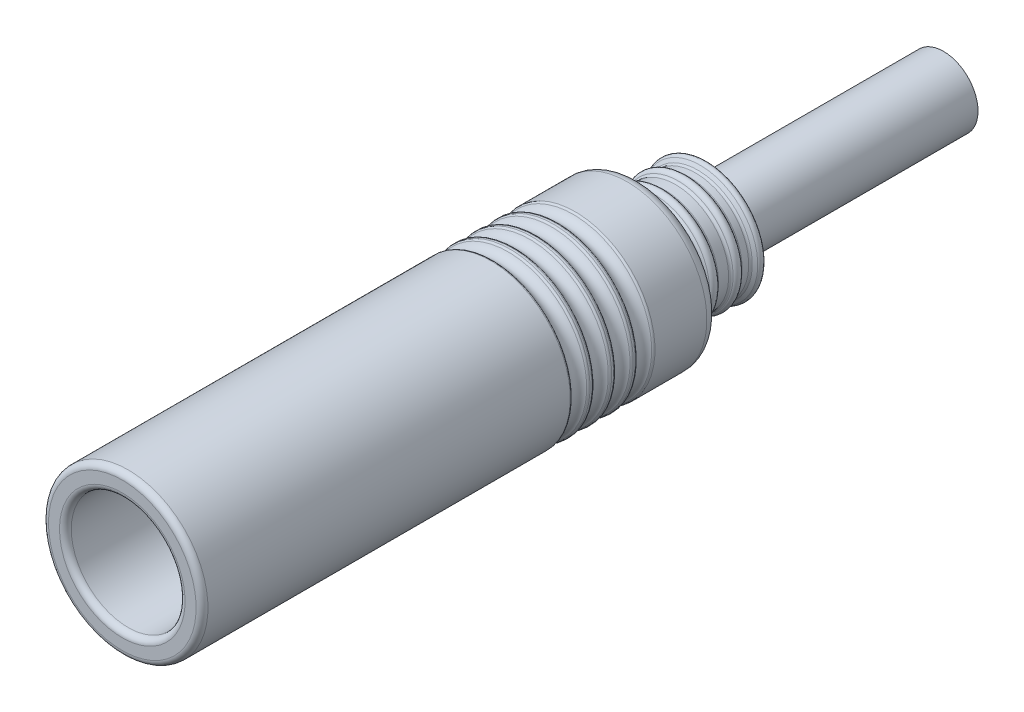
ISO-10303-21;
HEADER;
FILE_DESCRIPTION(('STEP AP214'),'2;1');
FILE_NAME('part.step','',(''),(''),'','','');
FILE_SCHEMA(('AUTOMOTIVE_DESIGN { 1 0 10303 214 1 1 1 1 }'));
ENDSEC;
DATA;
#1=APPLICATION_CONTEXT('core data for automotive mechanical design processes');
#2=APPLICATION_PROTOCOL_DEFINITION('international standard','automotive_design',2000,#1);
#3=PRODUCT_CONTEXT('',#1,'mechanical');
#4=PRODUCT('Part','Part','',(#3));
#5=PRODUCT_RELATED_PRODUCT_CATEGORY('part','',(#4));
#6=PRODUCT_DEFINITION_FORMATION('','',#4);
#7=PRODUCT_DEFINITION_CONTEXT('part definition',#1,'design');
#8=PRODUCT_DEFINITION('design','',#6,#7);
#9=PRODUCT_DEFINITION_SHAPE('','',#8);
#10=(LENGTH_UNIT() NAMED_UNIT(*) SI_UNIT(.MILLI.,.METRE.));
#11=(NAMED_UNIT(*) PLANE_ANGLE_UNIT() SI_UNIT($,.RADIAN.));
#12=(NAMED_UNIT(*) SI_UNIT($,.STERADIAN.) SOLID_ANGLE_UNIT());
#13=UNCERTAINTY_MEASURE_WITH_UNIT(LENGTH_MEASURE(1.E-05),#10,'distance_accuracy_value','');
#14=(GEOMETRIC_REPRESENTATION_CONTEXT(3) GLOBAL_UNCERTAINTY_ASSIGNED_CONTEXT((#13)) GLOBAL_UNIT_ASSIGNED_CONTEXT((#10,
#11,#12)) REPRESENTATION_CONTEXT('',''));
#15=CARTESIAN_POINT('',(0.,0.,0.));
#16=DIRECTION('',(0.,0.,1.));
#17=DIRECTION('',(1.,0.,0.));
#18=AXIS2_PLACEMENT_3D('',#15,#16,#17);
#19=CARTESIAN_POINT('',(0.,0.,-49.5));
#20=DIRECTION('',(0.,0.,-1.));
#21=DIRECTION('',(-1.,0.,0.));
#22=AXIS2_PLACEMENT_3D('',#19,#20,#21);
#23=CYLINDRICAL_SURFACE('',#22,6.75);
#24=CARTESIAN_POINT('',(0.,0.,-32.9980371945521));
#25=DIRECTION('',(0.,0.,-1.));
#26=DIRECTION('',(-1.,0.,0.));
#27=AXIS2_PLACEMENT_3D('',#24,#25,#26);
#28=CIRCLE('',#27,6.75);
#29=CARTESIAN_POINT('',(-6.75,0.,-32.9980371945521));
#30=VERTEX_POINT('',#29);
#31=EDGE_CURVE('E167',#30,#30,#28,.T.);
#32=ORIENTED_EDGE('',*,*,#31,.F.);
#33=EDGE_LOOP('',(#32));
#34=FACE_BOUND('',#33,.T.);
#35=CARTESIAN_POINT('',(0.,0.,-32.8352961387813));
#36=DIRECTION('',(0.,0.,-1.));
#37=DIRECTION('',(-1.,0.,0.));
#38=AXIS2_PLACEMENT_3D('',#35,#36,#37);
#39=CIRCLE('',#38,6.75);
#40=CARTESIAN_POINT('',(-6.75,0.,-32.8352961387813));
#41=VERTEX_POINT('',#40);
#42=EDGE_CURVE('E49',#41,#41,#39,.T.);
#43=ORIENTED_EDGE('',*,*,#42,.T.);
#44=EDGE_LOOP('',(#43));
#45=FACE_BOUND('',#44,.T.);
#46=ADVANCED_FACE('F42',(#34,#45),#23,.T.);
#47=CARTESIAN_POINT('',(0.,0.,-32.8352961387813));
#48=DIRECTION('',(0.,0.,-1.));
#49=DIRECTION('',(-1.,0.,0.));
#50=AXIS2_PLACEMENT_3D('',#47,#48,#49);
#51=TOROIDAL_SURFACE('',#50,6.54999999999996,0.200000000000001);
#52=CARTESIAN_POINT('',(0.,0.,-32.6594443200905));
#53=DIRECTION('',(0.,0.,-1.));
#54=DIRECTION('',(-1.,0.,0.));
#55=AXIS2_PLACEMENT_3D('',#52,#53,#54);
#56=CIRCLE('',#55,6.6452687664617);
#57=CARTESIAN_POINT('',(-6.6452687664617,0.,-32.6594443200905));
#58=VERTEX_POINT('',#57);
#59=EDGE_CURVE('E53',#58,#58,#56,.T.);
#60=ORIENTED_EDGE('',*,*,#59,.T.);
#61=EDGE_LOOP('',(#60));
#62=FACE_BOUND('',#61,.T.);
#63=ORIENTED_EDGE('',*,*,#42,.F.);
#64=EDGE_LOOP('',(#63));
#65=FACE_BOUND('',#64,.T.);
#66=ADVANCED_FACE('F44',(#62,#65),#51,.T.);
#67=CARTESIAN_POINT('',(0.,0.,-32.));
#68=DIRECTION('',(0.,0.,-1.));
#69=DIRECTION('',(-1.,0.,0.));
#70=AXIS2_PLACEMENT_3D('',#67,#68,#69);
#71=TOROIDAL_SURFACE('',#70,7.00252664069321,0.749999999999997);
#72=ORIENTED_EDGE('',*,*,#59,.F.);
#73=EDGE_LOOP('',(#72));
#74=FACE_BOUND('',#73,.T.);
#75=CARTESIAN_POINT('',(0.,0.,-31.3405556799095));
#76=DIRECTION('',(0.,0.,-1.));
#77=DIRECTION('',(-1.,0.,0.));
#78=AXIS2_PLACEMENT_3D('',#75,#76,#77);
#79=CIRCLE('',#78,6.6452687664617);
#80=CARTESIAN_POINT('',(-6.6452687664617,0.,-31.3405556799095));
#81=VERTEX_POINT('',#80);
#82=EDGE_CURVE('E57',#81,#81,#79,.T.);
#83=ORIENTED_EDGE('',*,*,#82,.T.);
#84=EDGE_LOOP('',(#83));
#85=FACE_BOUND('',#84,.T.);
#86=ADVANCED_FACE('F196',(#74,#85),#71,.F.);
#87=CARTESIAN_POINT('',(0.,0.,-31.1647038612187));
#88=DIRECTION('',(0.,0.,-1.));
#89=DIRECTION('',(-1.,0.,0.));
#90=AXIS2_PLACEMENT_3D('',#87,#88,#89);
#91=TOROIDAL_SURFACE('',#90,6.54999999999996,0.200000000000001);
#92=CARTESIAN_POINT('',(0.,0.,-31.1647038612187));
#93=DIRECTION('',(0.,0.,-1.));
#94=DIRECTION('',(-1.,0.,0.));
#95=AXIS2_PLACEMENT_3D('',#92,#93,#94);
#96=CIRCLE('',#95,6.75);
#97=CARTESIAN_POINT('',(-6.75,0.,-31.1647038612187));
#98=VERTEX_POINT('',#97);
#99=EDGE_CURVE('E62',#98,#98,#96,.T.);
#100=ORIENTED_EDGE('',*,*,#99,.T.);
#101=EDGE_LOOP('',(#100));
#102=FACE_BOUND('',#101,.T.);
#103=ORIENTED_EDGE('',*,*,#82,.F.);
#104=EDGE_LOOP('',(#103));
#105=FACE_BOUND('',#104,.T.);
#106=ADVANCED_FACE('F203',(#102,#105),#91,.T.);
#107=ORIENTED_EDGE('',*,*,#99,.F.);
#108=EDGE_LOOP('',(#107));
#109=FACE_BOUND('',#108,.T.);
#110=CARTESIAN_POINT('',(0.,0.,-0.5));
#111=DIRECTION('',(0.,0.,-1.));
#112=DIRECTION('',(-1.,0.,0.));
#113=AXIS2_PLACEMENT_3D('',#110,#111,#112);
#114=CIRCLE('',#113,6.75);
#115=CARTESIAN_POINT('',(-6.75,0.,-0.5));
#116=VERTEX_POINT('',#115);
#117=EDGE_CURVE('E65',#116,#116,#114,.T.);
#118=ORIENTED_EDGE('',*,*,#117,.T.);
#119=EDGE_LOOP('',(#118));
#120=FACE_BOUND('',#119,.T.);
#121=ADVANCED_FACE('F191',(#109,#120),#23,.T.);
#122=CARTESIAN_POINT('',(0.,0.,-0.5));
#123=DIRECTION('',(0.,0.,-1.));
#124=DIRECTION('',(-1.,0.,0.));
#125=AXIS2_PLACEMENT_3D('',#122,#123,#124);
#126=TOROIDAL_SURFACE('',#125,6.25,0.5);
#127=ORIENTED_EDGE('',*,*,#117,.F.);
#128=EDGE_LOOP('',(#127));
#129=FACE_BOUND('',#128,.T.);
#130=CARTESIAN_POINT('',(0.,0.,0.));
#131=DIRECTION('',(0.,0.,-1.));
#132=DIRECTION('',(-1.,0.,0.));
#133=AXIS2_PLACEMENT_3D('',#130,#131,#132);
#134=CIRCLE('',#133,6.24999999999999);
#135=CARTESIAN_POINT('',(-6.24999999999999,0.,0.));
#136=VERTEX_POINT('',#135);
#137=EDGE_CURVE('E68',#136,#136,#134,.T.);
#138=ORIENTED_EDGE('',*,*,#137,.T.);
#139=EDGE_LOOP('',(#138));
#140=FACE_BOUND('',#139,.T.);
#141=ADVANCED_FACE('F202',(#129,#140),#126,.T.);
#142=CARTESIAN_POINT('',(0.,0.,0.));
#143=DIRECTION('',(0.,0.,-1.));
#144=DIRECTION('',(-1.,0.,0.));
#145=AXIS2_PLACEMENT_3D('',#142,#143,#144);
#146=PLANE('',#145);
#147=ORIENTED_EDGE('',*,*,#137,.F.);
#148=EDGE_LOOP('',(#147));
#149=FACE_BOUND('',#148,.T.);
#150=CARTESIAN_POINT('',(0.,0.,0.));
#151=DIRECTION('',(0.,0.,-1.));
#152=DIRECTION('',(-1.,0.,0.));
#153=AXIS2_PLACEMENT_3D('',#150,#151,#152);
#154=CIRCLE('',#153,5.315);
#155=CARTESIAN_POINT('',(-5.315,0.,0.));
#156=VERTEX_POINT('',#155);
#157=EDGE_CURVE('E71',#156,#156,#154,.T.);
#158=ORIENTED_EDGE('',*,*,#157,.T.);
#159=EDGE_LOOP('',(#158));
#160=FACE_BOUND('',#159,.T.);
#161=ADVANCED_FACE('F336',(#149,#160),#146,.F.);
#162=CARTESIAN_POINT('',(0.,0.,-0.5));
#163=DIRECTION('',(0.,0.,-1.));
#164=DIRECTION('',(-1.,0.,0.));
#165=AXIS2_PLACEMENT_3D('',#162,#163,#164);
#166=TOROIDAL_SURFACE('',#165,5.315,0.5);
#167=CARTESIAN_POINT('',(0.,0.,-0.5));
#168=DIRECTION('',(0.,0.,-1.));
#169=DIRECTION('',(-1.,0.,0.));
#170=AXIS2_PLACEMENT_3D('',#167,#168,#169);
#171=CIRCLE('',#170,4.815);
#172=CARTESIAN_POINT('',(-4.815,0.,-0.5));
#173=VERTEX_POINT('',#172);
#174=EDGE_CURVE('E74',#173,#173,#171,.T.);
#175=ORIENTED_EDGE('',*,*,#174,.T.);
#176=EDGE_LOOP('',(#175));
#177=FACE_BOUND('',#176,.T.);
#178=ORIENTED_EDGE('',*,*,#157,.F.);
#179=EDGE_LOOP('',(#178));
#180=FACE_BOUND('',#179,.T.);
#181=ADVANCED_FACE('F332',(#177,#180),#166,.T.);
#182=CARTESIAN_POINT('',(0.,0.,-49.5));
#183=DIRECTION('',(0.,0.,-1.));
#184=DIRECTION('',(-1.,0.,0.));
#185=AXIS2_PLACEMENT_3D('',#182,#183,#184);
#186=CYLINDRICAL_SURFACE('',#185,4.815);
#187=ORIENTED_EDGE('',*,*,#174,.F.);
#188=EDGE_LOOP('',(#187));
#189=FACE_BOUND('',#188,.T.);
#190=CARTESIAN_POINT('',(0.,0.,-8.37));
#191=DIRECTION('',(0.,0.,-1.));
#192=DIRECTION('',(-1.,0.,0.));
#193=AXIS2_PLACEMENT_3D('',#190,#191,#192);
#194=CIRCLE('',#193,4.815);
#195=CARTESIAN_POINT('',(-4.815,0.,-8.37));
#196=VERTEX_POINT('',#195);
#197=EDGE_CURVE('E77',#196,#196,#194,.T.);
#198=ORIENTED_EDGE('',*,*,#197,.T.);
#199=EDGE_LOOP('',(#198));
#200=FACE_BOUND('',#199,.T.);
#201=ADVANCED_FACE('F328',(#189,#200),#186,.F.);
#202=CARTESIAN_POINT('',(0.,0.,-8.37));
#203=DIRECTION('',(0.,0.,-1.));
#204=DIRECTION('',(-1.,0.,0.));
#205=AXIS2_PLACEMENT_3D('',#202,#203,#204);
#206=PLANE('',#205);
#207=ORIENTED_EDGE('',*,*,#197,.F.);
#208=EDGE_LOOP('',(#207));
#209=FACE_BOUND('',#208,.T.);
#210=ADVANCED_FACE('F324',(#209),#206,.F.);
#211=CARTESIAN_POINT('',(0.,0.,-49.5));
#212=DIRECTION('',(0.,0.,1.));
#213=DIRECTION('',(1.,0.,0.));
#214=AXIS2_PLACEMENT_3D('',#211,#212,#213);
#215=PLANE('',#214);
#216=CARTESIAN_POINT('',(0.,0.,-49.5));
#217=DIRECTION('',(0.,0.,1.));
#218=DIRECTION('',(1.,0.,0.));
#219=AXIS2_PLACEMENT_3D('',#216,#217,#218);
#220=CIRCLE('',#219,2.92);
#221=CARTESIAN_POINT('',(2.92,0.,-49.5));
#222=VERTEX_POINT('',#221);
#223=EDGE_CURVE('E12',#222,#222,#220,.F.);
#224=ORIENTED_EDGE('',*,*,#223,.F.);
#225=EDGE_LOOP('',(#224));
#226=FACE_BOUND('',#225,.T.);
#227=CARTESIAN_POINT('',(0.,0.,-49.5));
#228=DIRECTION('',(0.,0.,-1.));
#229=DIRECTION('',(-1.,0.,0.));
#230=AXIS2_PLACEMENT_3D('',#227,#228,#229);
#231=CIRCLE('',#230,4.675);
#232=CARTESIAN_POINT('',(-4.675,0.,-49.5));
#233=VERTEX_POINT('',#232);
#234=EDGE_CURVE('E80',#233,#233,#231,.T.);
#235=ORIENTED_EDGE('',*,*,#234,.T.);
#236=EDGE_LOOP('',(#235));
#237=FACE_BOUND('',#236,.T.);
#238=ADVANCED_FACE('F320',(#226,#237),#215,.F.);
#239=CARTESIAN_POINT('',(0.,0.,-49.175));
#240=DIRECTION('',(0.,0.,-1.));
#241=DIRECTION('',(-1.,0.,0.));
#242=AXIS2_PLACEMENT_3D('',#239,#240,#241);
#243=TOROIDAL_SURFACE('',#242,4.675,0.325000000000002);
#244=ORIENTED_EDGE('',*,*,#234,.F.);
#245=EDGE_LOOP('',(#244));
#246=FACE_BOUND('',#245,.T.);
#247=CARTESIAN_POINT('',(0.,0.,-48.9129963528466));
#248=DIRECTION('',(0.,0.,-1.));
#249=DIRECTION('',(-1.,0.,0.));
#250=AXIS2_PLACEMENT_3D('',#247,#248,#249);
#251=CIRCLE('',#250,4.86729947706197);
#252=CARTESIAN_POINT('',(-4.86729947706197,0.,-48.9129963528466));
#253=VERTEX_POINT('',#252);
#254=EDGE_CURVE('E83',#253,#253,#251,.T.);
#255=ORIENTED_EDGE('',*,*,#254,.T.);
#256=EDGE_LOOP('',(#255));
#257=FACE_BOUND('',#256,.T.);
#258=ADVANCED_FACE('F316',(#246,#257),#243,.T.);
#259=CARTESIAN_POINT('',(0.,0.,-48.7183346310114));
#260=DIRECTION('',(0.,0.,-1.));
#261=DIRECTION('',(-1.,0.,0.));
#262=AXIS2_PLACEMENT_3D('',#259,#260,#261);
#263=CONICAL_SURFACE('',#262,4.60207732533695,0.93764188458531);
#264=ORIENTED_EDGE('',*,*,#254,.F.);
#265=EDGE_LOOP('',(#264));
#266=FACE_BOUND('',#265,.T.);
#267=CARTESIAN_POINT('',(0.,0.,-48.7183346310114));
#268=DIRECTION('',(0.,0.,-1.));
#269=DIRECTION('',(-1.,0.,0.));
#270=AXIS2_PLACEMENT_3D('',#267,#268,#269);
#271=CIRCLE('',#270,4.60207732533695);
#272=CARTESIAN_POINT('',(-4.60207732533695,0.,-48.7183346310114));
#273=VERTEX_POINT('',#272);
#274=EDGE_CURVE('E86',#273,#273,#271,.T.);
#275=ORIENTED_EDGE('',*,*,#274,.T.);
#276=EDGE_LOOP('',(#275));
#277=FACE_BOUND('',#276,.T.);
#278=ADVANCED_FACE('F312',(#266,#277),#263,.T.);
#279=CARTESIAN_POINT('',(0.,0.,-48.5167933639704));
#280=DIRECTION('',(0.,0.,-1.));
#281=DIRECTION('',(-1.,0.,0.));
#282=AXIS2_PLACEMENT_3D('',#279,#280,#281);
#283=TOROIDAL_SURFACE('',#282,4.75,0.249999999999999);
#284=ORIENTED_EDGE('',*,*,#274,.F.);
#285=EDGE_LOOP('',(#284));
#286=FACE_BOUND('',#285,.T.);
#287=CARTESIAN_POINT('',(0.,0.,-48.5167933639704));
#288=DIRECTION('',(0.,0.,-1.));
#289=DIRECTION('',(-1.,0.,0.));
#290=AXIS2_PLACEMENT_3D('',#287,#288,#289);
#291=CIRCLE('',#290,4.5);
#292=CARTESIAN_POINT('',(-4.5,0.,-48.5167933639704));
#293=VERTEX_POINT('',#292);
#294=EDGE_CURVE('E89',#293,#293,#291,.T.);
#295=ORIENTED_EDGE('',*,*,#294,.T.);
#296=EDGE_LOOP('',(#295));
#297=FACE_BOUND('',#296,.T.);
#298=ADVANCED_FACE('F308',(#286,#297),#283,.F.);
#299=CARTESIAN_POINT('',(0.,0.,-49.5));
#300=DIRECTION('',(0.,0.,-1.));
#301=DIRECTION('',(-1.,0.,0.));
#302=AXIS2_PLACEMENT_3D('',#299,#300,#301);
#303=CYLINDRICAL_SURFACE('',#302,4.5);
#304=ORIENTED_EDGE('',*,*,#294,.F.);
#305=EDGE_LOOP('',(#304));
#306=FACE_BOUND('',#305,.T.);
#307=CARTESIAN_POINT('',(0.,0.,-47.9627198701166));
#308=DIRECTION('',(0.,0.,-1.));
#309=DIRECTION('',(-1.,0.,0.));
#310=AXIS2_PLACEMENT_3D('',#307,#308,#309);
#311=CIRCLE('',#310,4.5);
#312=CARTESIAN_POINT('',(-4.5,0.,-47.9627198701166));
#313=VERTEX_POINT('',#312);
#314=EDGE_CURVE('E92',#313,#313,#311,.T.);
#315=ORIENTED_EDGE('',*,*,#314,.T.);
#316=EDGE_LOOP('',(#315));
#317=FACE_BOUND('',#316,.T.);
#318=ADVANCED_FACE('F304',(#306,#317),#303,.T.);
#319=CARTESIAN_POINT('',(0.,0.,-47.9627198701166));
#320=DIRECTION('',(0.,0.,-1.));
#321=DIRECTION('',(-1.,0.,0.));
#322=AXIS2_PLACEMENT_3D('',#319,#320,#321);
#323=TOROIDAL_SURFACE('',#322,4.75,0.250000000000002);
#324=ORIENTED_EDGE('',*,*,#314,.F.);
#325=EDGE_LOOP('',(#324));
#326=FACE_BOUND('',#325,.T.);
#327=CARTESIAN_POINT('',(0.,0.,-47.7335910853688));
#328=DIRECTION('',(0.,0.,-1.));
#329=DIRECTION('',(-1.,0.,0.));
#330=AXIS2_PLACEMENT_3D('',#327,#328,#329);
#331=CIRCLE('',#330,4.65);
#332=CARTESIAN_POINT('',(-4.65,0.,-47.7335910853688));
#333=VERTEX_POINT('',#332);
#334=EDGE_CURVE('E95',#333,#333,#331,.T.);
#335=ORIENTED_EDGE('',*,*,#334,.T.);
#336=EDGE_LOOP('',(#335));
#337=FACE_BOUND('',#336,.T.);
#338=ADVANCED_FACE('F300',(#326,#337),#323,.F.);
#339=CARTESIAN_POINT('',(0.,0.,-47.3898979082471));
#340=DIRECTION('',(0.,0.,-1.));
#341=DIRECTION('',(-1.,0.,0.));
#342=AXIS2_PLACEMENT_3D('',#339,#340,#341);
#343=TOROIDAL_SURFACE('',#342,4.5,0.375);
#344=CARTESIAN_POINT('',(0.,0.,-47.0462047311254));
#345=DIRECTION('',(0.,0.,-1.));
#346=DIRECTION('',(-1.,0.,0.));
#347=AXIS2_PLACEMENT_3D('',#344,#345,#346);
#348=CIRCLE('',#347,4.65);
#349=CARTESIAN_POINT('',(-4.65,0.,-47.0462047311254));
#350=VERTEX_POINT('',#349);
#351=EDGE_CURVE('E98',#350,#350,#348,.T.);
#352=ORIENTED_EDGE('',*,*,#351,.T.);
#353=EDGE_LOOP('',(#352));
#354=FACE_BOUND('',#353,.T.);
#355=ORIENTED_EDGE('',*,*,#334,.F.);
#356=EDGE_LOOP('',(#355));
#357=FACE_BOUND('',#356,.T.);
#358=ADVANCED_FACE('F296',(#354,#357),#343,.T.);
#359=CARTESIAN_POINT('',(0.,0.,-46.8170759463776));
#360=DIRECTION('',(0.,0.,-1.));
#361=DIRECTION('',(-1.,0.,0.));
#362=AXIS2_PLACEMENT_3D('',#359,#360,#361);
#363=TOROIDAL_SURFACE('',#362,4.75,0.249999999999999);
#364=CARTESIAN_POINT('',(0.,0.,-46.8170759463776));
#365=DIRECTION('',(0.,0.,-1.));
#366=DIRECTION('',(-1.,0.,0.));
#367=AXIS2_PLACEMENT_3D('',#364,#365,#366);
#368=CIRCLE('',#367,4.5);
#369=CARTESIAN_POINT('',(-4.5,0.,-46.8170759463776));
#370=VERTEX_POINT('',#369);
#371=EDGE_CURVE('E101',#370,#370,#368,.T.);
#372=ORIENTED_EDGE('',*,*,#371,.T.);
#373=EDGE_LOOP('',(#372));
#374=FACE_BOUND('',#373,.T.);
#375=ORIENTED_EDGE('',*,*,#351,.F.);
#376=EDGE_LOOP('',(#375));
#377=FACE_BOUND('',#376,.T.);
#378=ADVANCED_FACE('F292',(#374,#377),#363,.F.);
#379=CARTESIAN_POINT('',(0.,0.,-49.5));
#380=DIRECTION('',(0.,0.,-1.));
#381=DIRECTION('',(-1.,0.,0.));
#382=AXIS2_PLACEMENT_3D('',#379,#380,#381);
#383=CYLINDRICAL_SURFACE('',#382,4.5);
#384=ORIENTED_EDGE('',*,*,#371,.F.);
#385=EDGE_LOOP('',(#384));
#386=FACE_BOUND('',#385,.T.);
#387=CARTESIAN_POINT('',(0.,0.,-45.9627198701166));
#388=DIRECTION('',(0.,0.,-1.));
#389=DIRECTION('',(-1.,0.,0.));
#390=AXIS2_PLACEMENT_3D('',#387,#388,#389);
#391=CIRCLE('',#390,4.5);
#392=CARTESIAN_POINT('',(-4.5,0.,-45.9627198701166));
#393=VERTEX_POINT('',#392);
#394=EDGE_CURVE('E104',#393,#393,#391,.T.);
#395=ORIENTED_EDGE('',*,*,#394,.T.);
#396=EDGE_LOOP('',(#395));
#397=FACE_BOUND('',#396,.T.);
#398=ADVANCED_FACE('F288',(#386,#397),#383,.T.);
#399=CARTESIAN_POINT('',(0.,0.,-45.9627198701166));
#400=DIRECTION('',(0.,0.,-1.));
#401=DIRECTION('',(-1.,0.,0.));
#402=AXIS2_PLACEMENT_3D('',#399,#400,#401);
#403=TOROIDAL_SURFACE('',#402,4.75,0.249999999999999);
#404=ORIENTED_EDGE('',*,*,#394,.F.);
#405=EDGE_LOOP('',(#404));
#406=FACE_BOUND('',#405,.T.);
#407=CARTESIAN_POINT('',(0.,0.,-45.7335910853688));
#408=DIRECTION('',(0.,0.,-1.));
#409=DIRECTION('',(-1.,0.,0.));
#410=AXIS2_PLACEMENT_3D('',#407,#408,#409);
#411=CIRCLE('',#410,4.65);
#412=CARTESIAN_POINT('',(-4.65,0.,-45.7335910853688));
#413=VERTEX_POINT('',#412);
#414=EDGE_CURVE('E107',#413,#413,#411,.T.);
#415=ORIENTED_EDGE('',*,*,#414,.T.);
#416=EDGE_LOOP('',(#415));
#417=FACE_BOUND('',#416,.T.);
#418=ADVANCED_FACE('F284',(#406,#417),#403,.F.);
#419=CARTESIAN_POINT('',(0.,0.,-45.3898979082471));
#420=DIRECTION('',(0.,0.,-1.));
#421=DIRECTION('',(-1.,0.,0.));
#422=AXIS2_PLACEMENT_3D('',#419,#420,#421);
#423=TOROIDAL_SURFACE('',#422,4.5,0.375000000000003);
#424=CARTESIAN_POINT('',(0.,0.,-45.0462047311254));
#425=DIRECTION('',(0.,0.,-1.));
#426=DIRECTION('',(-1.,0.,0.));
#427=AXIS2_PLACEMENT_3D('',#424,#425,#426);
#428=CIRCLE('',#427,4.65);
#429=CARTESIAN_POINT('',(-4.65,0.,-45.0462047311254));
#430=VERTEX_POINT('',#429);
#431=EDGE_CURVE('E110',#430,#430,#428,.T.);
#432=ORIENTED_EDGE('',*,*,#431,.T.);
#433=EDGE_LOOP('',(#432));
#434=FACE_BOUND('',#433,.T.);
#435=ORIENTED_EDGE('',*,*,#414,.F.);
#436=EDGE_LOOP('',(#435));
#437=FACE_BOUND('',#436,.T.);
#438=ADVANCED_FACE('F280',(#434,#437),#423,.T.);
#439=CARTESIAN_POINT('',(0.,0.,-44.8170759463776));
#440=DIRECTION('',(0.,0.,-1.));
#441=DIRECTION('',(-1.,0.,0.));
#442=AXIS2_PLACEMENT_3D('',#439,#440,#441);
#443=TOROIDAL_SURFACE('',#442,4.75,0.249999999999999);
#444=CARTESIAN_POINT('',(0.,0.,-44.8170759463776));
#445=DIRECTION('',(0.,0.,-1.));
#446=DIRECTION('',(-1.,0.,0.));
#447=AXIS2_PLACEMENT_3D('',#444,#445,#446);
#448=CIRCLE('',#447,4.5);
#449=CARTESIAN_POINT('',(-4.5,0.,-44.8170759463776));
#450=VERTEX_POINT('',#449);
#451=EDGE_CURVE('E113',#450,#450,#448,.T.);
#452=ORIENTED_EDGE('',*,*,#451,.T.);
#453=EDGE_LOOP('',(#452));
#454=FACE_BOUND('',#453,.T.);
#455=ORIENTED_EDGE('',*,*,#431,.F.);
#456=EDGE_LOOP('',(#455));
#457=FACE_BOUND('',#456,.T.);
#458=ADVANCED_FACE('F276',(#454,#457),#443,.F.);
#459=CARTESIAN_POINT('',(0.,0.,-49.5));
#460=DIRECTION('',(0.,0.,-1.));
#461=DIRECTION('',(-1.,0.,0.));
#462=AXIS2_PLACEMENT_3D('',#459,#460,#461);
#463=CYLINDRICAL_SURFACE('',#462,4.5);
#464=ORIENTED_EDGE('',*,*,#451,.F.);
#465=EDGE_LOOP('',(#464));
#466=FACE_BOUND('',#465,.T.);
#467=CARTESIAN_POINT('',(0.,0.,-44.7670759463776));
#468=DIRECTION('',(0.,0.,-1.));
#469=DIRECTION('',(-1.,0.,0.));
#470=AXIS2_PLACEMENT_3D('',#467,#468,#469);
#471=CIRCLE('',#470,4.5);
#472=CARTESIAN_POINT('',(-4.5,0.,-44.7670759463776));
#473=VERTEX_POINT('',#472);
#474=EDGE_CURVE('E116',#473,#473,#471,.T.);
#475=ORIENTED_EDGE('',*,*,#474,.T.);
#476=EDGE_LOOP('',(#475));
#477=FACE_BOUND('',#476,.T.);
#478=ADVANCED_FACE('F272',(#466,#477),#463,.T.);
#479=CARTESIAN_POINT('',(0.,0.,-44.7670759463776));
#480=DIRECTION('',(0.,0.,-1.));
#481=DIRECTION('',(-1.,0.,0.));
#482=AXIS2_PLACEMENT_3D('',#479,#480,#481);
#483=TOROIDAL_SURFACE('',#482,4.75,0.250000000000001);
#484=ORIENTED_EDGE('',*,*,#474,.F.);
#485=EDGE_LOOP('',(#484));
#486=FACE_BOUND('',#485,.T.);
#487=CARTESIAN_POINT('',(0.,0.,-44.6705574370158));
#488=DIRECTION('',(0.,0.,-1.));
#489=DIRECTION('',(-1.,0.,0.));
#490=AXIS2_PLACEMENT_3D('',#487,#488,#489);
#491=CIRCLE('',#490,4.51938305059998);
#492=CARTESIAN_POINT('',(-4.51938305059998,0.,-44.6705574370158));
#493=VERTEX_POINT('',#492);
#494=EDGE_CURVE('E119',#493,#493,#491,.T.);
#495=ORIENTED_EDGE('',*,*,#494,.T.);
#496=EDGE_LOOP('',(#495));
#497=FACE_BOUND('',#496,.T.);
#498=ADVANCED_FACE('F268',(#486,#497),#483,.F.);
#499=CARTESIAN_POINT('',(0.,0.,-44.119531756012));
#500=DIRECTION('',(0.,0.,1.));
#501=DIRECTION('',(1.,0.,0.));
#502=AXIS2_PLACEMENT_3D('',#499,#500,#501);
#503=CONICAL_SURFACE('',#502,4.75,0.396371848155564);
#504=ORIENTED_EDGE('',*,*,#494,.F.);
#505=EDGE_LOOP('',(#504));
#506=FACE_BOUND('',#505,.T.);
#507=CARTESIAN_POINT('',(0.,0.,-44.119531756012));
#508=DIRECTION('',(0.,0.,-1.));
#509=DIRECTION('',(-1.,0.,0.));
#510=AXIS2_PLACEMENT_3D('',#507,#508,#509);
#511=CIRCLE('',#510,4.75);
#512=CARTESIAN_POINT('',(-4.75,0.,-44.119531756012));
#513=VERTEX_POINT('',#512);
#514=EDGE_CURVE('E122',#513,#513,#511,.T.);
#515=ORIENTED_EDGE('',*,*,#514,.T.);
#516=EDGE_LOOP('',(#515));
#517=FACE_BOUND('',#516,.T.);
#518=ADVANCED_FACE('F264',(#506,#517),#503,.T.);
#519=CARTESIAN_POINT('',(0.,0.,-44.3125687747357));
#520=DIRECTION('',(0.,0.,-1.));
#521=DIRECTION('',(-1.,0.,0.));
#522=AXIS2_PLACEMENT_3D('',#519,#520,#521);
#523=TOROIDAL_SURFACE('',#522,5.21123389880003,0.500000000000001);
#524=ORIENTED_EDGE('',*,*,#514,.F.);
#525=EDGE_LOOP('',(#524));
#526=FACE_BOUND('',#525,.T.);
#527=CARTESIAN_POINT('',(0.,0.,-43.8170759463776));
#528=DIRECTION('',(0.,0.,-1.));
#529=DIRECTION('',(-1.,0.,0.));
#530=AXIS2_PLACEMENT_3D('',#527,#528,#529);
#531=CIRCLE('',#530,5.14424989290527);
#532=CARTESIAN_POINT('',(-5.14424989290527,0.,-43.8170759463776));
#533=VERTEX_POINT('',#532);
#534=EDGE_CURVE('E125',#533,#533,#531,.T.);
#535=ORIENTED_EDGE('',*,*,#534,.T.);
#536=EDGE_LOOP('',(#535));
#537=FACE_BOUND('',#536,.T.);
#538=ADVANCED_FACE('F256',(#526,#537),#523,.F.);
#539=CARTESIAN_POINT('',(0.,0.,-43.7170759463776));
#540=DIRECTION('',(0.,0.,1.));
#541=DIRECTION('',(1.,0.,0.));
#542=AXIS2_PLACEMENT_3D('',#539,#540,#541);
#543=CONICAL_SURFACE('',#542,5.88396801178953,1.43642431335636);
#544=ORIENTED_EDGE('',*,*,#534,.F.);
#545=EDGE_LOOP('',(#544));
#546=FACE_BOUND('',#545,.T.);
#547=CARTESIAN_POINT('',(0.,0.,-43.7170759463776));
#548=DIRECTION('',(0.,0.,-1.));
#549=DIRECTION('',(-1.,0.,0.));
#550=AXIS2_PLACEMENT_3D('',#547,#548,#549);
#551=CIRCLE('',#550,5.88396801178953);
#552=CARTESIAN_POINT('',(-5.88396801178953,0.,-43.7170759463776));
#553=VERTEX_POINT('',#552);
#554=EDGE_CURVE('E128',#553,#553,#551,.T.);
#555=ORIENTED_EDGE('',*,*,#554,.T.);
#556=EDGE_LOOP('',(#555));
#557=FACE_BOUND('',#556,.T.);
#558=ADVANCED_FACE('F245',(#546,#557),#543,.T.);
#559=CARTESIAN_POINT('',(0.,0.,-42.7260902896615));
#560=DIRECTION('',(0.,0.,-1.));
#561=DIRECTION('',(-1.,0.,0.));
#562=AXIS2_PLACEMENT_3D('',#559,#560,#561);
#563=TOROIDAL_SURFACE('',#562,5.75,1.);
#564=ORIENTED_EDGE('',*,*,#554,.F.);
#565=EDGE_LOOP('',(#564));
#566=FACE_BOUND('',#565,.T.);
#567=CARTESIAN_POINT('',(0.,0.,-42.7260902896615));
#568=DIRECTION('',(0.,0.,-1.));
#569=DIRECTION('',(-1.,0.,0.));
#570=AXIS2_PLACEMENT_3D('',#567,#568,#569);
#571=CIRCLE('',#570,6.75);
#572=CARTESIAN_POINT('',(-6.75,0.,-42.7260902896615));
#573=VERTEX_POINT('',#572);
#574=EDGE_CURVE('E131',#573,#573,#571,.T.);
#575=ORIENTED_EDGE('',*,*,#574,.T.);
#576=EDGE_LOOP('',(#575));
#577=FACE_BOUND('',#576,.T.);
#578=ADVANCED_FACE('F237',(#566,#577),#563,.T.);
#579=ORIENTED_EDGE('',*,*,#574,.F.);
#580=EDGE_LOOP('',(#579));
#581=FACE_BOUND('',#580,.T.);
#582=CARTESIAN_POINT('',(0.,0.,-38.3352961387813));
#583=DIRECTION('',(0.,0.,-1.));
#584=DIRECTION('',(-1.,0.,0.));
#585=AXIS2_PLACEMENT_3D('',#582,#583,#584);
#586=CIRCLE('',#585,6.75);
#587=CARTESIAN_POINT('',(-6.75,0.,-38.3352961387813));
#588=VERTEX_POINT('',#587);
#589=EDGE_CURVE('E134',#588,#588,#586,.T.);
#590=ORIENTED_EDGE('',*,*,#589,.T.);
#591=EDGE_LOOP('',(#590));
#592=FACE_BOUND('',#591,.T.);
#593=ADVANCED_FACE('F205',(#581,#592),#23,.T.);
#594=CARTESIAN_POINT('',(0.,0.,-38.3352961387813));
#595=DIRECTION('',(0.,0.,-1.));
#596=DIRECTION('',(-1.,0.,0.));
#597=AXIS2_PLACEMENT_3D('',#594,#595,#596);
#598=TOROIDAL_SURFACE('',#597,6.55,0.200000000000001);
#599=CARTESIAN_POINT('',(0.,0.,-38.1594443200905));
#600=DIRECTION('',(0.,0.,-1.));
#601=DIRECTION('',(-1.,0.,0.));
#602=AXIS2_PLACEMENT_3D('',#599,#600,#601);
#603=CIRCLE('',#602,6.64526876646173);
#604=CARTESIAN_POINT('',(-6.64526876646173,0.,-38.1594443200905));
#605=VERTEX_POINT('',#604);
#606=EDGE_CURVE('E137',#605,#605,#603,.T.);
#607=ORIENTED_EDGE('',*,*,#606,.T.);
#608=EDGE_LOOP('',(#607));
#609=FACE_BOUND('',#608,.T.);
#610=ORIENTED_EDGE('',*,*,#589,.F.);
#611=EDGE_LOOP('',(#610));
#612=FACE_BOUND('',#611,.T.);
#613=ADVANCED_FACE('F236',(#609,#612),#598,.T.);
#614=CARTESIAN_POINT('',(0.,0.,-37.5));
#615=DIRECTION('',(0.,0.,-1.));
#616=DIRECTION('',(-1.,0.,0.));
#617=AXIS2_PLACEMENT_3D('',#614,#615,#616);
#618=TOROIDAL_SURFACE('',#617,7.00252664069325,0.749999999999997);
#619=ORIENTED_EDGE('',*,*,#606,.F.);
#620=EDGE_LOOP('',(#619));
#621=FACE_BOUND('',#620,.T.);
#622=CARTESIAN_POINT('',(0.,0.,-36.8405556799095));
#623=DIRECTION('',(0.,0.,-1.));
#624=DIRECTION('',(-1.,0.,0.));
#625=AXIS2_PLACEMENT_3D('',#622,#623,#624);
#626=CIRCLE('',#625,6.64526876646173);
#627=CARTESIAN_POINT('',(-6.64526876646173,0.,-36.8405556799095));
#628=VERTEX_POINT('',#627);
#629=EDGE_CURVE('E140',#628,#628,#626,.T.);
#630=ORIENTED_EDGE('',*,*,#629,.T.);
#631=EDGE_LOOP('',(#630));
#632=FACE_BOUND('',#631,.T.);
#633=ADVANCED_FACE('F230',(#621,#632),#618,.F.);
#634=CARTESIAN_POINT('',(0.,0.,-36.6647038612187));
#635=DIRECTION('',(0.,0.,-1.));
#636=DIRECTION('',(-1.,0.,0.));
#637=AXIS2_PLACEMENT_3D('',#634,#635,#636);
#638=TOROIDAL_SURFACE('',#637,6.55,0.200000000000001);
#639=CARTESIAN_POINT('',(0.,0.,-36.6647038612187));
#640=DIRECTION('',(0.,0.,-1.));
#641=DIRECTION('',(-1.,0.,0.));
#642=AXIS2_PLACEMENT_3D('',#639,#640,#641);
#643=CIRCLE('',#642,6.75);
#644=CARTESIAN_POINT('',(-6.75,0.,-36.6647038612187));
#645=VERTEX_POINT('',#644);
#646=EDGE_CURVE('E143',#645,#645,#643,.T.);
#647=ORIENTED_EDGE('',*,*,#646,.T.);
#648=EDGE_LOOP('',(#647));
#649=FACE_BOUND('',#648,.T.);
#650=ORIENTED_EDGE('',*,*,#629,.F.);
#651=EDGE_LOOP('',(#650));
#652=FACE_BOUND('',#651,.T.);
#653=ADVANCED_FACE('F222',(#649,#652),#638,.T.);
#654=ORIENTED_EDGE('',*,*,#646,.F.);
#655=EDGE_LOOP('',(#654));
#656=FACE_BOUND('',#655,.T.);
#657=CARTESIAN_POINT('',(0.,0.,-36.5019628054479));
#658=DIRECTION('',(0.,0.,-1.));
#659=DIRECTION('',(-1.,0.,0.));
#660=AXIS2_PLACEMENT_3D('',#657,#658,#659);
#661=CIRCLE('',#660,6.75);
#662=CARTESIAN_POINT('',(-6.75,0.,-36.5019628054479));
#663=VERTEX_POINT('',#662);
#664=EDGE_CURVE('E146',#663,#663,#661,.T.);
#665=ORIENTED_EDGE('',*,*,#664,.T.);
#666=EDGE_LOOP('',(#665));
#667=FACE_BOUND('',#666,.T.);
#668=ADVANCED_FACE('F210',(#656,#667),#23,.T.);
#669=CARTESIAN_POINT('',(0.,0.,-36.5019628054479));
#670=DIRECTION('',(0.,0.,-1.));
#671=DIRECTION('',(-1.,0.,0.));
#672=AXIS2_PLACEMENT_3D('',#669,#670,#671);
#673=TOROIDAL_SURFACE('',#672,6.54999999999998,0.200000000000001);
#674=CARTESIAN_POINT('',(0.,0.,-36.3261109867571));
#675=DIRECTION('',(0.,0.,-1.));
#676=DIRECTION('',(-1.,0.,0.));
#677=AXIS2_PLACEMENT_3D('',#674,#675,#676);
#678=CIRCLE('',#677,6.64526876646172);
#679=CARTESIAN_POINT('',(-6.64526876646172,0.,-36.3261109867571));
#680=VERTEX_POINT('',#679);
#681=EDGE_CURVE('E149',#680,#680,#678,.T.);
#682=ORIENTED_EDGE('',*,*,#681,.T.);
#683=EDGE_LOOP('',(#682));
#684=FACE_BOUND('',#683,.T.);
#685=ORIENTED_EDGE('',*,*,#664,.F.);
#686=EDGE_LOOP('',(#685));
#687=FACE_BOUND('',#686,.T.);
#688=ADVANCED_FACE('F221',(#684,#687),#673,.T.);
#689=CARTESIAN_POINT('',(0.,0.,-35.6666666666667));
#690=DIRECTION('',(0.,0.,-1.));
#691=DIRECTION('',(-1.,0.,0.));
#692=AXIS2_PLACEMENT_3D('',#689,#690,#691);
#693=TOROIDAL_SURFACE('',#692,7.00252664069324,0.749999999999997);
#694=ORIENTED_EDGE('',*,*,#681,.F.);
#695=EDGE_LOOP('',(#694));
#696=FACE_BOUND('',#695,.T.);
#697=CARTESIAN_POINT('',(0.,0.,-35.0072223465762));
#698=DIRECTION('',(0.,0.,-1.));
#699=DIRECTION('',(-1.,0.,0.));
#700=AXIS2_PLACEMENT_3D('',#697,#698,#699);
#701=CIRCLE('',#700,6.64526876646172);
#702=CARTESIAN_POINT('',(-6.64526876646172,0.,-35.0072223465762));
#703=VERTEX_POINT('',#702);
#704=EDGE_CURVE('E152',#703,#703,#701,.T.);
#705=ORIENTED_EDGE('',*,*,#704,.T.);
#706=EDGE_LOOP('',(#705));
#707=FACE_BOUND('',#706,.T.);
#708=ADVANCED_FACE('F216',(#696,#707),#693,.F.);
#709=CARTESIAN_POINT('',(0.,0.,-34.8313705278854));
#710=DIRECTION('',(0.,0.,-1.));
#711=DIRECTION('',(-1.,0.,0.));
#712=AXIS2_PLACEMENT_3D('',#709,#710,#711);
#713=TOROIDAL_SURFACE('',#712,6.54999999999998,0.200000000000001);
#714=CARTESIAN_POINT('',(0.,0.,-34.8313705278854));
#715=DIRECTION('',(0.,0.,-1.));
#716=DIRECTION('',(-1.,0.,0.));
#717=AXIS2_PLACEMENT_3D('',#714,#715,#716);
#718=CIRCLE('',#717,6.75);
#719=CARTESIAN_POINT('',(-6.75,0.,-34.8313705278854));
#720=VERTEX_POINT('',#719);
#721=EDGE_CURVE('E155',#720,#720,#718,.T.);
#722=ORIENTED_EDGE('',*,*,#721,.T.);
#723=EDGE_LOOP('',(#722));
#724=FACE_BOUND('',#723,.T.);
#725=ORIENTED_EDGE('',*,*,#704,.F.);
#726=EDGE_LOOP('',(#725));
#727=FACE_BOUND('',#726,.T.);
#728=ADVANCED_FACE('F208',(#724,#727),#713,.T.);
#729=ORIENTED_EDGE('',*,*,#721,.F.);
#730=EDGE_LOOP('',(#729));
#731=FACE_BOUND('',#730,.T.);
#732=CARTESIAN_POINT('',(0.,0.,-34.6686294721146));
#733=DIRECTION('',(0.,0.,-1.));
#734=DIRECTION('',(-1.,0.,0.));
#735=AXIS2_PLACEMENT_3D('',#732,#733,#734);
#736=CIRCLE('',#735,6.75);
#737=CARTESIAN_POINT('',(-6.75,0.,-34.6686294721146));
#738=VERTEX_POINT('',#737);
#739=EDGE_CURVE('E158',#738,#738,#736,.T.);
#740=ORIENTED_EDGE('',*,*,#739,.T.);
#741=EDGE_LOOP('',(#740));
#742=FACE_BOUND('',#741,.T.);
#743=ADVANCED_FACE('F192',(#731,#742),#23,.T.);
#744=CARTESIAN_POINT('',(0.,0.,-34.6686294721146));
#745=DIRECTION('',(0.,0.,-1.));
#746=DIRECTION('',(-1.,0.,0.));
#747=AXIS2_PLACEMENT_3D('',#744,#745,#746);
#748=TOROIDAL_SURFACE('',#747,6.54999999999997,0.200000000000001);
#749=CARTESIAN_POINT('',(0.,0.,-34.4927776534238));
#750=DIRECTION('',(0.,0.,-1.));
#751=DIRECTION('',(-1.,0.,0.));
#752=AXIS2_PLACEMENT_3D('',#749,#750,#751);
#753=CIRCLE('',#752,6.64526876646171);
#754=CARTESIAN_POINT('',(-6.64526876646171,0.,-34.4927776534238));
#755=VERTEX_POINT('',#754);
#756=EDGE_CURVE('E161',#755,#755,#753,.T.);
#757=ORIENTED_EDGE('',*,*,#756,.T.);
#758=EDGE_LOOP('',(#757));
#759=FACE_BOUND('',#758,.T.);
#760=ORIENTED_EDGE('',*,*,#739,.F.);
#761=EDGE_LOOP('',(#760));
#762=FACE_BOUND('',#761,.T.);
#763=ADVANCED_FACE('F207',(#759,#762),#748,.T.);
#764=CARTESIAN_POINT('',(0.,0.,-33.8333333333333));
#765=DIRECTION('',(0.,0.,-1.));
#766=DIRECTION('',(-1.,0.,0.));
#767=AXIS2_PLACEMENT_3D('',#764,#765,#766);
#768=TOROIDAL_SURFACE('',#767,7.00252664069323,0.749999999999997);
#769=ORIENTED_EDGE('',*,*,#756,.F.);
#770=EDGE_LOOP('',(#769));
#771=FACE_BOUND('',#770,.T.);
#772=CARTESIAN_POINT('',(0.,0.,-33.1738890132429));
#773=DIRECTION('',(0.,0.,-1.));
#774=DIRECTION('',(-1.,0.,0.));
#775=AXIS2_PLACEMENT_3D('',#772,#773,#774);
#776=CIRCLE('',#775,6.64526876646171);
#777=CARTESIAN_POINT('',(-6.64526876646171,0.,-33.1738890132429));
#778=VERTEX_POINT('',#777);
#779=EDGE_CURVE('E164',#778,#778,#776,.T.);
#780=ORIENTED_EDGE('',*,*,#779,.T.);
#781=EDGE_LOOP('',(#780));
#782=FACE_BOUND('',#781,.T.);
#783=ADVANCED_FACE('F185',(#771,#782),#768,.F.);
#784=CARTESIAN_POINT('',(0.,0.,-32.9980371945521));
#785=DIRECTION('',(0.,0.,-1.));
#786=DIRECTION('',(-1.,0.,0.));
#787=AXIS2_PLACEMENT_3D('',#784,#785,#786);
#788=TOROIDAL_SURFACE('',#787,6.54999999999997,0.200000000000001);
#789=ORIENTED_EDGE('',*,*,#31,.T.);
#790=EDGE_LOOP('',(#789));
#791=FACE_BOUND('',#790,.T.);
#792=ORIENTED_EDGE('',*,*,#779,.F.);
#793=EDGE_LOOP('',(#792));
#794=FACE_BOUND('',#793,.T.);
#795=ADVANCED_FACE('F178',(#791,#794),#788,.T.);
#796=CARTESIAN_POINT('',(0.,0.,-69.5));
#797=DIRECTION('',(0.,0.,1.));
#798=DIRECTION('',(1.,0.,0.));
#799=AXIS2_PLACEMENT_3D('',#796,#797,#798);
#800=CYLINDRICAL_SURFACE('',#799,2.92);
#801=CARTESIAN_POINT('',(0.,0.,-69.5));
#802=DIRECTION('',(0.,0.,-1.));
#803=DIRECTION('',(-1.,0.,0.));
#804=AXIS2_PLACEMENT_3D('',#801,#802,#803);
#805=CIRCLE('',#804,2.92);
#806=CARTESIAN_POINT('',(-2.92,0.,-69.5));
#807=VERTEX_POINT('',#806);
#808=EDGE_CURVE('E170',#807,#807,#805,.T.);
#809=ORIENTED_EDGE('',*,*,#808,.F.);
#810=EDGE_LOOP('',(#809));
#811=FACE_BOUND('',#810,.T.);
#812=ORIENTED_EDGE('',*,*,#223,.T.);
#813=EDGE_LOOP('',(#812));
#814=FACE_BOUND('',#813,.T.);
#815=ADVANCED_FACE('F176',(#811,#814),#800,.T.);
#816=CARTESIAN_POINT('',(0.,0.,-69.5));
#817=DIRECTION('',(0.,0.,-1.));
#818=DIRECTION('',(-1.,0.,0.));
#819=AXIS2_PLACEMENT_3D('',#816,#817,#818);
#820=PLANE('',#819);
#821=ORIENTED_EDGE('',*,*,#808,.T.);
#822=EDGE_LOOP('',(#821));
#823=FACE_BOUND('',#822,.T.);
#824=ADVANCED_FACE('F174',(#823),#820,.T.);
#825=CLOSED_SHELL('',(#46,#66,#86,#106,#121,#141,#161,#181,#201,#210,#238,#258,#278,#298,#318,
#338,#358,#378,#398,#418,#438,#458,#478,#498,#518,#538,#558,#578,#593,#613,#633,#653,#668,#688,
#708,#728,#743,#763,#783,#795,#815,#824));
#826=MANIFOLD_SOLID_BREP('B2',#825);
#827=ADVANCED_BREP_SHAPE_REPRESENTATION('',(#18,#826),#14);
#828=SHAPE_DEFINITION_REPRESENTATION(#9,#827);
ENDSEC;
END-ISO-10303-21;
